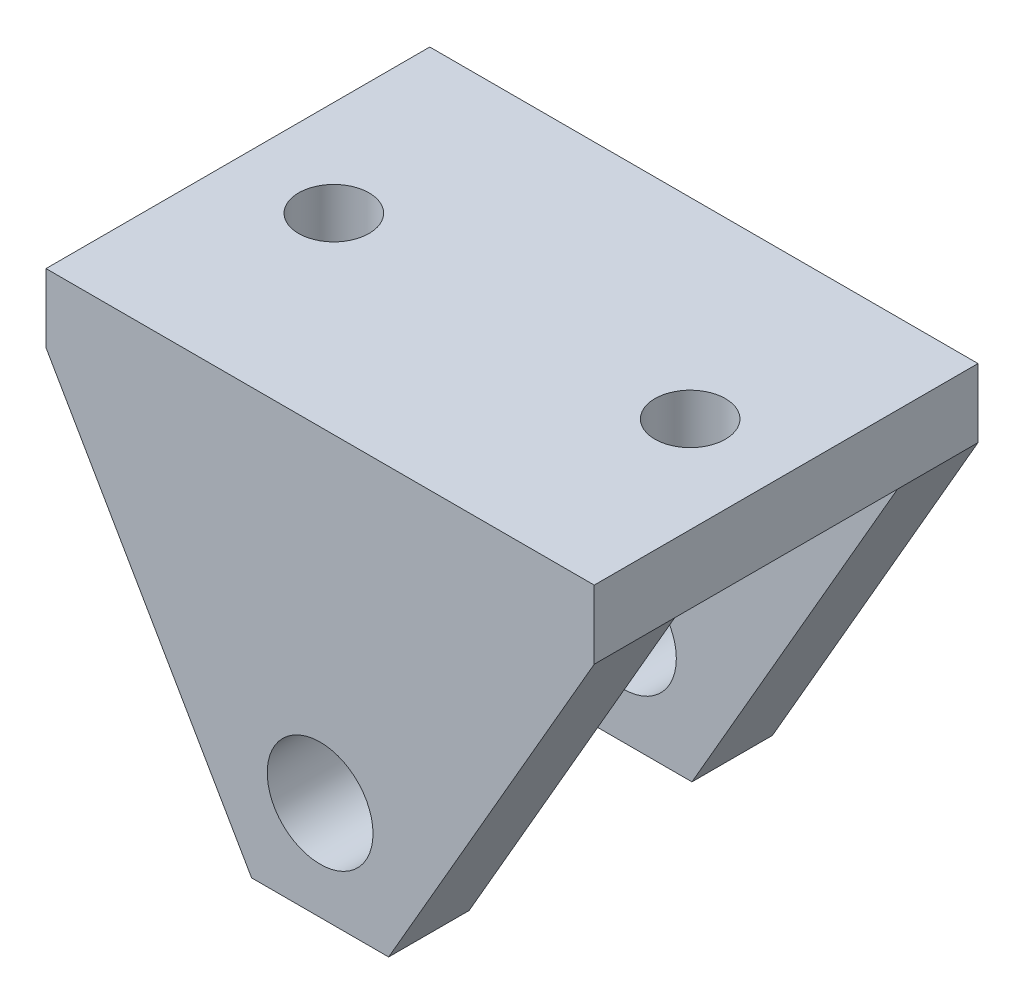
ISO-10303-21;
HEADER;
FILE_DESCRIPTION(('STEP AP214'),'2;1');
FILE_NAME('part.step','',(''),(''),'','','');
FILE_SCHEMA(('AUTOMOTIVE_DESIGN { 1 0 10303 214 1 1 1 1 }'));
ENDSEC;
DATA;
#1=APPLICATION_CONTEXT('core data for automotive mechanical design processes');
#2=APPLICATION_PROTOCOL_DEFINITION('international standard','automotive_design',2000,#1);
#3=PRODUCT_CONTEXT('',#1,'mechanical');
#4=PRODUCT('Part','Part','',(#3));
#5=PRODUCT_RELATED_PRODUCT_CATEGORY('part','',(#4));
#6=PRODUCT_DEFINITION_FORMATION('','',#4);
#7=PRODUCT_DEFINITION_CONTEXT('part definition',#1,'design');
#8=PRODUCT_DEFINITION('design','',#6,#7);
#9=PRODUCT_DEFINITION_SHAPE('','',#8);
#10=(LENGTH_UNIT() NAMED_UNIT(*) SI_UNIT(.MILLI.,.METRE.));
#11=(NAMED_UNIT(*) PLANE_ANGLE_UNIT() SI_UNIT($,.RADIAN.));
#12=(NAMED_UNIT(*) SI_UNIT($,.STERADIAN.) SOLID_ANGLE_UNIT());
#13=UNCERTAINTY_MEASURE_WITH_UNIT(LENGTH_MEASURE(1.E-05),#10,'distance_accuracy_value','');
#14=(GEOMETRIC_REPRESENTATION_CONTEXT(3) GLOBAL_UNCERTAINTY_ASSIGNED_CONTEXT((#13)) GLOBAL_UNIT_ASSIGNED_CONTEXT((#10,
#11,#12)) REPRESENTATION_CONTEXT('',''));
#15=CARTESIAN_POINT('',(0.,0.,0.));
#16=DIRECTION('',(0.,0.,1.));
#17=DIRECTION('',(1.,0.,0.));
#18=AXIS2_PLACEMENT_3D('',#15,#16,#17);
#19=CARTESIAN_POINT('',(0.,-39.37,0.));
#20=DIRECTION('',(0.,1.,0.));
#21=DIRECTION('',(0.,0.,1.));
#22=AXIS2_PLACEMENT_3D('',#19,#20,#21);
#23=PLANE('',#22);
#24=DIRECTION('',(0.,0.,1.));
#25=VECTOR('',#24,1.);
#26=CARTESIAN_POINT('',(-6.35,-39.37,-17.78));
#27=LINE('',#26,#25);
#28=CARTESIAN_POINT('',(-6.35,-39.37,10.3251));
#29=VERTEX_POINT('',#28);
#30=CARTESIAN_POINT('',(-6.35,-39.37,17.78));
#31=VERTEX_POINT('',#30);
#32=EDGE_CURVE('E169',#29,#31,#27,.T.);
#33=ORIENTED_EDGE('',*,*,#32,.F.);
#34=DIRECTION('',(-1.,0.,0.));
#35=VECTOR('',#34,1.);
#36=CARTESIAN_POINT('',(-25.4,-39.37,10.3251));
#37=LINE('',#36,#35);
#38=CARTESIAN_POINT('',(6.35,-39.37,10.3251));
#39=VERTEX_POINT('',#38);
#40=EDGE_CURVE('E145',#39,#29,#37,.T.);
#41=ORIENTED_EDGE('',*,*,#40,.F.);
#42=DIRECTION('',(0.,0.,1.));
#43=VECTOR('',#42,1.);
#44=CARTESIAN_POINT('',(6.35,-39.37,-17.78));
#45=LINE('',#44,#43);
#46=CARTESIAN_POINT('',(6.35,-39.37,17.78));
#47=VERTEX_POINT('',#46);
#48=EDGE_CURVE('E74',#39,#47,#45,.T.);
#49=ORIENTED_EDGE('',*,*,#48,.T.);
#50=DIRECTION('',(1.,0.,0.));
#51=VECTOR('',#50,1.);
#52=CARTESIAN_POINT('',(-25.4,-39.37,17.78));
#53=LINE('',#52,#51);
#54=EDGE_CURVE('E192',#31,#47,#53,.T.);
#55=ORIENTED_EDGE('',*,*,#54,.F.);
#56=EDGE_LOOP('',(#33,#41,#49,#55));
#57=FACE_BOUND('',#56,.T.);
#58=ADVANCED_FACE('F49',(#57),#23,.F.);
#59=CARTESIAN_POINT('',(-16.51,-39.37,0.));
#60=DIRECTION('',(0.,1.,0.));
#61=DIRECTION('',(0.,0.,1.));
#62=AXIS2_PLACEMENT_3D('',#59,#60,#61);
#63=CYLINDRICAL_SURFACE('',#62,3.2639);
#64=CARTESIAN_POINT('',(-16.51,0.,0.));
#65=DIRECTION('',(0.,1.,0.));
#66=DIRECTION('',(0.,0.,1.));
#67=AXIS2_PLACEMENT_3D('',#64,#65,#66);
#68=CIRCLE('',#67,3.2639);
#69=CARTESIAN_POINT('',(-16.51,0.,3.2639));
#70=VERTEX_POINT('',#69);
#71=EDGE_CURVE('E162',#70,#70,#68,.T.);
#72=ORIENTED_EDGE('',*,*,#71,.T.);
#73=EDGE_LOOP('',(#72));
#74=FACE_BOUND('',#73,.T.);
#75=CARTESIAN_POINT('',(-16.51,-6.35,0.));
#76=DIRECTION('',(0.,-1.,0.));
#77=DIRECTION('',(0.,0.,-1.));
#78=AXIS2_PLACEMENT_3D('',#75,#76,#77);
#79=CIRCLE('',#78,3.2639);
#80=CARTESIAN_POINT('',(-16.51,-6.35,-3.2639));
#81=VERTEX_POINT('',#80);
#82=EDGE_CURVE('E187',#81,#81,#79,.F.);
#83=ORIENTED_EDGE('',*,*,#82,.F.);
#84=EDGE_LOOP('',(#83));
#85=FACE_BOUND('',#84,.T.);
#86=ADVANCED_FACE('F277',(#74,#85),#63,.F.);
#87=CARTESIAN_POINT('',(16.51,-39.37,0.));
#88=DIRECTION('',(0.,1.,0.));
#89=DIRECTION('',(0.,0.,1.));
#90=AXIS2_PLACEMENT_3D('',#87,#88,#89);
#91=CYLINDRICAL_SURFACE('',#90,3.2639);
#92=CARTESIAN_POINT('',(16.51,0.,0.));
#93=DIRECTION('',(0.,1.,0.));
#94=DIRECTION('',(0.,0.,-1.));
#95=AXIS2_PLACEMENT_3D('',#92,#93,#94);
#96=CIRCLE('',#95,3.2639);
#97=CARTESIAN_POINT('',(16.51,0.,-3.2639));
#98=VERTEX_POINT('',#97);
#99=EDGE_CURVE('E158',#98,#98,#96,.T.);
#100=ORIENTED_EDGE('',*,*,#99,.T.);
#101=EDGE_LOOP('',(#100));
#102=FACE_BOUND('',#101,.T.);
#103=CARTESIAN_POINT('',(16.51,-6.35,0.));
#104=DIRECTION('',(0.,-1.,0.));
#105=DIRECTION('',(0.,0.,-1.));
#106=AXIS2_PLACEMENT_3D('',#103,#104,#105);
#107=CIRCLE('',#106,3.2639);
#108=CARTESIAN_POINT('',(16.51,-6.35,-3.2639));
#109=VERTEX_POINT('',#108);
#110=EDGE_CURVE('E229',#109,#109,#107,.F.);
#111=ORIENTED_EDGE('',*,*,#110,.F.);
#112=EDGE_LOOP('',(#111));
#113=FACE_BOUND('',#112,.T.);
#114=ADVANCED_FACE('F282',(#102,#113),#91,.F.);
#115=CARTESIAN_POINT('',(25.4,-6.35,-17.78));
#116=DIRECTION('',(-0.8661855860486,0.499722453489577,0.));
#117=DIRECTION('',(-0.499722453489577,-0.866185586048601,0.));
#118=AXIS2_PLACEMENT_3D('',#115,#116,#117);
#119=PLANE('',#118);
#120=ORIENTED_EDGE('',*,*,#48,.F.);
#121=DIRECTION('',(0.499722453489577,0.866185586048601,0.));
#122=VECTOR('',#121,1.);
#123=CARTESIAN_POINT('',(25.4,-6.35,10.3251));
#124=LINE('',#123,#122);
#125=CARTESIAN_POINT('',(25.4,-6.35,10.3251));
#126=VERTEX_POINT('',#125);
#127=EDGE_CURVE('E226',#39,#126,#124,.T.);
#128=ORIENTED_EDGE('',*,*,#127,.T.);
#129=DIRECTION('',(0.,0.,1.));
#130=VECTOR('',#129,1.);
#131=CARTESIAN_POINT('',(25.4,-6.35,-17.78));
#132=LINE('',#131,#130);
#133=CARTESIAN_POINT('',(25.4,-6.35,17.78));
#134=VERTEX_POINT('',#133);
#135=EDGE_CURVE('E177',#126,#134,#132,.T.);
#136=ORIENTED_EDGE('',*,*,#135,.T.);
#137=DIRECTION('',(-0.499722453489577,-0.866185586048601,0.));
#138=VECTOR('',#137,1.);
#139=CARTESIAN_POINT('',(25.4,-6.35,17.78));
#140=LINE('',#139,#138);
#141=EDGE_CURVE('E178',#134,#47,#140,.T.);
#142=ORIENTED_EDGE('',*,*,#141,.T.);
#143=EDGE_LOOP('',(#120,#128,#136,#142));
#144=FACE_BOUND('',#143,.T.);
#145=ADVANCED_FACE('F286',(#144),#119,.F.);
#146=CARTESIAN_POINT('',(-25.4,-6.35,-17.78));
#147=DIRECTION('',(0.8661855860486,0.499722453489577,0.));
#148=DIRECTION('',(-0.499722453489577,0.866185586048601,0.));
#149=AXIS2_PLACEMENT_3D('',#146,#147,#148);
#150=PLANE('',#149);
#151=DIRECTION('',(0.,0.,1.));
#152=VECTOR('',#151,1.);
#153=CARTESIAN_POINT('',(-25.4,-6.35,-17.78));
#154=LINE('',#153,#152);
#155=CARTESIAN_POINT('',(-25.4,-6.35,10.3251));
#156=VERTEX_POINT('',#155);
#157=CARTESIAN_POINT('',(-25.4,-6.35,17.78));
#158=VERTEX_POINT('',#157);
#159=EDGE_CURVE('E159',#156,#158,#154,.T.);
#160=ORIENTED_EDGE('',*,*,#159,.F.);
#161=DIRECTION('',(0.499722453489577,-0.866185586048601,0.));
#162=VECTOR('',#161,1.);
#163=CARTESIAN_POINT('',(-25.4,-6.35,10.3251));
#164=LINE('',#163,#162);
#165=EDGE_CURVE('E223',#156,#29,#164,.T.);
#166=ORIENTED_EDGE('',*,*,#165,.T.);
#167=ORIENTED_EDGE('',*,*,#32,.T.);
#168=DIRECTION('',(-0.499722453489577,0.866185586048601,0.));
#169=VECTOR('',#168,1.);
#170=CARTESIAN_POINT('',(-25.4,-6.35,17.78));
#171=LINE('',#170,#169);
#172=EDGE_CURVE('E166',#31,#158,#171,.T.);
#173=ORIENTED_EDGE('',*,*,#172,.T.);
#174=EDGE_LOOP('',(#160,#166,#167,#173));
#175=FACE_BOUND('',#174,.T.);
#176=ADVANCED_FACE('F242',(#175),#150,.F.);
#177=CARTESIAN_POINT('',(0.,-30.196811844,-17.78));
#178=DIRECTION('',(0.,0.,1.));
#179=DIRECTION('',(1.,0.,0.));
#180=AXIS2_PLACEMENT_3D('',#177,#178,#179);
#181=CYLINDRICAL_SURFACE('',#180,4.9022);
#182=CARTESIAN_POINT('',(0.,-30.196811844,10.3251));
#183=DIRECTION('',(0.,0.,1.));
#184=DIRECTION('',(1.,0.,0.));
#185=AXIS2_PLACEMENT_3D('',#182,#183,#184);
#186=CIRCLE('',#185,4.9022);
#187=CARTESIAN_POINT('',(4.9022,-30.196811844,10.3251));
#188=VERTEX_POINT('',#187);
#189=EDGE_CURVE('E53',#188,#188,#186,.F.);
#190=ORIENTED_EDGE('',*,*,#189,.T.);
#191=EDGE_LOOP('',(#190));
#192=FACE_BOUND('',#191,.T.);
#193=CARTESIAN_POINT('',(0.,-30.196811844,17.78));
#194=DIRECTION('',(0.,0.,1.));
#195=DIRECTION('',(1.,0.,0.));
#196=AXIS2_PLACEMENT_3D('',#193,#194,#195);
#197=CIRCLE('',#196,4.9022);
#198=CARTESIAN_POINT('',(4.9022,-30.196811844,17.78));
#199=VERTEX_POINT('',#198);
#200=EDGE_CURVE('E182',#199,#199,#197,.T.);
#201=ORIENTED_EDGE('',*,*,#200,.T.);
#202=EDGE_LOOP('',(#201));
#203=FACE_BOUND('',#202,.T.);
#204=ADVANCED_FACE('F306',(#192,#203),#181,.F.);
#205=CARTESIAN_POINT('',(-25.4,-39.37,-17.78));
#206=DIRECTION('',(-1.,0.,0.));
#207=DIRECTION('',(0.,0.,1.));
#208=AXIS2_PLACEMENT_3D('',#205,#206,#207);
#209=PLANE('',#208);
#210=CARTESIAN_POINT('',(-25.4,-6.35,-17.78));
#211=VERTEX_POINT('',#210);
#212=CARTESIAN_POINT('',(-25.4,-6.35,-10.3251));
#213=VERTEX_POINT('',#212);
#214=EDGE_CURVE('E150',#211,#213,#154,.T.);
#215=ORIENTED_EDGE('',*,*,#214,.T.);
#216=DIRECTION('',(0.,0.,-1.));
#217=VECTOR('',#216,1.);
#218=CARTESIAN_POINT('',(-25.4,-6.35,10.3251));
#219=LINE('',#218,#217);
#220=EDGE_CURVE('E138',#156,#213,#219,.T.);
#221=ORIENTED_EDGE('',*,*,#220,.F.);
#222=ORIENTED_EDGE('',*,*,#159,.T.);
#223=DIRECTION('',(0.,1.,0.));
#224=VECTOR('',#223,1.);
#225=CARTESIAN_POINT('',(-25.4,-39.37,17.78));
#226=LINE('',#225,#224);
#227=CARTESIAN_POINT('',(-25.4,0.,17.78));
#228=VERTEX_POINT('',#227);
#229=EDGE_CURVE('E199',#158,#228,#226,.T.);
#230=ORIENTED_EDGE('',*,*,#229,.T.);
#231=DIRECTION('',(0.,0.,1.));
#232=VECTOR('',#231,1.);
#233=CARTESIAN_POINT('',(-25.4,0.,-17.78));
#234=LINE('',#233,#232);
#235=CARTESIAN_POINT('',(-25.4,0.,-17.78));
#236=VERTEX_POINT('',#235);
#237=EDGE_CURVE('E191',#236,#228,#234,.T.);
#238=ORIENTED_EDGE('',*,*,#237,.F.);
#239=DIRECTION('',(0.,1.,0.));
#240=VECTOR('',#239,1.);
#241=CARTESIAN_POINT('',(-25.4,-39.37,-17.78));
#242=LINE('',#241,#240);
#243=EDGE_CURVE('E11',#211,#236,#242,.T.);
#244=ORIENTED_EDGE('',*,*,#243,.F.);
#245=EDGE_LOOP('',(#215,#221,#222,#230,#238,#244));
#246=FACE_BOUND('',#245,.T.);
#247=ADVANCED_FACE('F51',(#246),#209,.T.);
#248=CARTESIAN_POINT('',(-25.4,-39.37,-17.78));
#249=DIRECTION('',(0.,0.,-1.));
#250=DIRECTION('',(-1.,0.,0.));
#251=AXIS2_PLACEMENT_3D('',#248,#249,#250);
#252=PLANE('',#251);
#253=DIRECTION('',(-0.499722453489577,0.866185586048601,0.));
#254=VECTOR('',#253,1.);
#255=CARTESIAN_POINT('',(-25.4,-6.35,-17.78));
#256=LINE('',#255,#254);
#257=CARTESIAN_POINT('',(-6.35,-39.37,-17.78));
#258=VERTEX_POINT('',#257);
#259=EDGE_CURVE('E235',#258,#211,#256,.T.);
#260=ORIENTED_EDGE('',*,*,#259,.T.);
#261=ORIENTED_EDGE('',*,*,#243,.T.);
#262=DIRECTION('',(-1.,0.,0.));
#263=VECTOR('',#262,1.);
#264=CARTESIAN_POINT('',(-25.4,0.,-17.78));
#265=LINE('',#264,#263);
#266=CARTESIAN_POINT('',(25.4,0.,-17.78));
#267=VERTEX_POINT('',#266);
#268=EDGE_CURVE('E196',#267,#236,#265,.T.);
#269=ORIENTED_EDGE('',*,*,#268,.F.);
#270=DIRECTION('',(0.,1.,0.));
#271=VECTOR('',#270,1.);
#272=CARTESIAN_POINT('',(25.4,-39.37,-17.78));
#273=LINE('',#272,#271);
#274=CARTESIAN_POINT('',(25.4,-6.35,-17.78));
#275=VERTEX_POINT('',#274);
#276=EDGE_CURVE('E58',#275,#267,#273,.T.);
#277=ORIENTED_EDGE('',*,*,#276,.F.);
#278=DIRECTION('',(-0.499722453489577,-0.866185586048601,0.));
#279=VECTOR('',#278,1.);
#280=CARTESIAN_POINT('',(25.4,-6.35,-17.78));
#281=LINE('',#280,#279);
#282=CARTESIAN_POINT('',(6.35,-39.37,-17.78));
#283=VERTEX_POINT('',#282);
#284=EDGE_CURVE('E173',#275,#283,#281,.T.);
#285=ORIENTED_EDGE('',*,*,#284,.T.);
#286=DIRECTION('',(-1.,0.,0.));
#287=VECTOR('',#286,1.);
#288=CARTESIAN_POINT('',(-25.4,-39.37,-17.78));
#289=LINE('',#288,#287);
#290=EDGE_CURVE('E195',#283,#258,#289,.T.);
#291=ORIENTED_EDGE('',*,*,#290,.T.);
#292=EDGE_LOOP('',(#260,#261,#269,#277,#285,#291));
#293=FACE_BOUND('',#292,.T.);
#294=CARTESIAN_POINT('',(0.,-30.196811844,-17.78));
#295=DIRECTION('',(0.,0.,1.));
#296=DIRECTION('',(1.,0.,0.));
#297=AXIS2_PLACEMENT_3D('',#294,#295,#296);
#298=CIRCLE('',#297,4.9022);
#299=CARTESIAN_POINT('',(4.9022,-30.196811844,-17.78));
#300=VERTEX_POINT('',#299);
#301=EDGE_CURVE('E185',#300,#300,#298,.T.);
#302=ORIENTED_EDGE('',*,*,#301,.T.);
#303=EDGE_LOOP('',(#302));
#304=FACE_BOUND('',#303,.T.);
#305=ADVANCED_FACE('F253',(#293,#304),#252,.T.);
#306=CARTESIAN_POINT('',(25.4,-39.37,-17.78));
#307=DIRECTION('',(1.,0.,0.));
#308=DIRECTION('',(0.,0.,-1.));
#309=AXIS2_PLACEMENT_3D('',#306,#307,#308);
#310=PLANE('',#309);
#311=CARTESIAN_POINT('',(25.4,-6.35,-10.3251));
#312=VERTEX_POINT('',#311);
#313=EDGE_CURVE('E174',#275,#312,#132,.T.);
#314=ORIENTED_EDGE('',*,*,#313,.F.);
#315=ORIENTED_EDGE('',*,*,#276,.T.);
#316=DIRECTION('',(0.,0.,-1.));
#317=VECTOR('',#316,1.);
#318=CARTESIAN_POINT('',(25.4,0.,-17.78));
#319=LINE('',#318,#317);
#320=CARTESIAN_POINT('',(25.4,0.,17.78));
#321=VERTEX_POINT('',#320);
#322=EDGE_CURVE('E205',#321,#267,#319,.T.);
#323=ORIENTED_EDGE('',*,*,#322,.F.);
#324=DIRECTION('',(0.,1.,0.));
#325=VECTOR('',#324,1.);
#326=CARTESIAN_POINT('',(25.4,-39.37,17.78));
#327=LINE('',#326,#325);
#328=EDGE_CURVE('E211',#134,#321,#327,.T.);
#329=ORIENTED_EDGE('',*,*,#328,.F.);
#330=ORIENTED_EDGE('',*,*,#135,.F.);
#331=DIRECTION('',(0.,0.,1.));
#332=VECTOR('',#331,1.);
#333=CARTESIAN_POINT('',(25.4,-6.35,10.3251));
#334=LINE('',#333,#332);
#335=EDGE_CURVE('E137',#312,#126,#334,.T.);
#336=ORIENTED_EDGE('',*,*,#335,.F.);
#337=EDGE_LOOP('',(#314,#315,#323,#329,#330,#336));
#338=FACE_BOUND('',#337,.T.);
#339=ADVANCED_FACE('F258',(#338),#310,.T.);
#340=CARTESIAN_POINT('',(-25.4,-39.37,17.78));
#341=DIRECTION('',(0.,0.,1.));
#342=DIRECTION('',(1.,0.,0.));
#343=AXIS2_PLACEMENT_3D('',#340,#341,#342);
#344=PLANE('',#343);
#345=ORIENTED_EDGE('',*,*,#172,.F.);
#346=ORIENTED_EDGE('',*,*,#54,.T.);
#347=ORIENTED_EDGE('',*,*,#141,.F.);
#348=ORIENTED_EDGE('',*,*,#328,.T.);
#349=DIRECTION('',(1.,0.,0.));
#350=VECTOR('',#349,1.);
#351=CARTESIAN_POINT('',(-25.4,0.,17.78));
#352=LINE('',#351,#350);
#353=EDGE_CURVE('E202',#228,#321,#352,.T.);
#354=ORIENTED_EDGE('',*,*,#353,.F.);
#355=ORIENTED_EDGE('',*,*,#229,.F.);
#356=EDGE_LOOP('',(#345,#346,#347,#348,#354,#355));
#357=FACE_BOUND('',#356,.T.);
#358=ORIENTED_EDGE('',*,*,#200,.F.);
#359=EDGE_LOOP('',(#358));
#360=FACE_BOUND('',#359,.T.);
#361=ADVANCED_FACE('F246',(#357,#360),#344,.T.);
#362=CARTESIAN_POINT('',(6.34999999999999,-39.37,-10.3251));
#363=VERTEX_POINT('',#362);
#364=EDGE_CURVE('E170',#283,#363,#45,.T.);
#365=ORIENTED_EDGE('',*,*,#364,.T.);
#366=DIRECTION('',(1.,0.,0.));
#367=VECTOR('',#366,1.);
#368=CARTESIAN_POINT('',(-25.4,-39.37,-10.3251));
#369=LINE('',#368,#367);
#370=CARTESIAN_POINT('',(-6.35,-39.37,-10.3251));
#371=VERTEX_POINT('',#370);
#372=EDGE_CURVE('E219',#371,#363,#369,.T.);
#373=ORIENTED_EDGE('',*,*,#372,.F.);
#374=EDGE_CURVE('E153',#258,#371,#27,.T.);
#375=ORIENTED_EDGE('',*,*,#374,.F.);
#376=ORIENTED_EDGE('',*,*,#290,.F.);
#377=EDGE_LOOP('',(#365,#373,#375,#376));
#378=FACE_BOUND('',#377,.T.);
#379=ADVANCED_FACE('F264',(#378),#23,.F.);
#380=CARTESIAN_POINT('',(0.,0.,0.));
#381=DIRECTION('',(0.,1.,0.));
#382=DIRECTION('',(0.,0.,1.));
#383=AXIS2_PLACEMENT_3D('',#380,#381,#382);
#384=PLANE('',#383);
#385=ORIENTED_EDGE('',*,*,#99,.F.);
#386=EDGE_LOOP('',(#385));
#387=FACE_BOUND('',#386,.T.);
#388=ORIENTED_EDGE('',*,*,#71,.F.);
#389=EDGE_LOOP('',(#388));
#390=FACE_BOUND('',#389,.T.);
#391=ORIENTED_EDGE('',*,*,#237,.T.);
#392=ORIENTED_EDGE('',*,*,#353,.T.);
#393=ORIENTED_EDGE('',*,*,#322,.T.);
#394=ORIENTED_EDGE('',*,*,#268,.T.);
#395=EDGE_LOOP('',(#391,#392,#393,#394));
#396=FACE_BOUND('',#395,.T.);
#397=ADVANCED_FACE('F250',(#387,#390,#396),#384,.T.);
#398=ORIENTED_EDGE('',*,*,#313,.T.);
#399=DIRECTION('',(-0.499722453489577,-0.866185586048601,0.));
#400=VECTOR('',#399,1.);
#401=CARTESIAN_POINT('',(25.4,-6.35,-10.3251));
#402=LINE('',#401,#400);
#403=EDGE_CURVE('E135',#312,#363,#402,.T.);
#404=ORIENTED_EDGE('',*,*,#403,.T.);
#405=ORIENTED_EDGE('',*,*,#364,.F.);
#406=ORIENTED_EDGE('',*,*,#284,.F.);
#407=EDGE_LOOP('',(#398,#404,#405,#406));
#408=FACE_BOUND('',#407,.T.);
#409=ADVANCED_FACE('F262',(#408),#119,.F.);
#410=ORIENTED_EDGE('',*,*,#374,.T.);
#411=DIRECTION('',(-0.499722453489577,0.866185586048601,0.));
#412=VECTOR('',#411,1.);
#413=CARTESIAN_POINT('',(-25.4,-6.35,-10.3251));
#414=LINE('',#413,#412);
#415=EDGE_CURVE('E132',#371,#213,#414,.T.);
#416=ORIENTED_EDGE('',*,*,#415,.T.);
#417=ORIENTED_EDGE('',*,*,#214,.F.);
#418=ORIENTED_EDGE('',*,*,#259,.F.);
#419=EDGE_LOOP('',(#410,#416,#417,#418));
#420=FACE_BOUND('',#419,.T.);
#421=ADVANCED_FACE('F149',(#420),#150,.F.);
#422=CARTESIAN_POINT('',(0.,-30.196811844,-10.3251));
#423=DIRECTION('',(0.,0.,-1.));
#424=DIRECTION('',(-1.,0.,0.));
#425=AXIS2_PLACEMENT_3D('',#422,#423,#424);
#426=CIRCLE('',#425,4.9022);
#427=CARTESIAN_POINT('',(-4.9022,-30.196811844,-10.3251));
#428=VERTEX_POINT('',#427);
#429=EDGE_CURVE('E154',#428,#428,#426,.F.);
#430=ORIENTED_EDGE('',*,*,#429,.T.);
#431=EDGE_LOOP('',(#430));
#432=FACE_BOUND('',#431,.T.);
#433=ORIENTED_EDGE('',*,*,#301,.F.);
#434=EDGE_LOOP('',(#433));
#435=FACE_BOUND('',#434,.T.);
#436=ADVANCED_FACE('F297',(#432,#435),#181,.F.);
#437=CARTESIAN_POINT('',(0.,-6.35,0.));
#438=DIRECTION('',(0.,-1.,0.));
#439=DIRECTION('',(0.,0.,-1.));
#440=AXIS2_PLACEMENT_3D('',#437,#438,#439);
#441=PLANE('',#440);
#442=ORIENTED_EDGE('',*,*,#220,.T.);
#443=DIRECTION('',(1.,0.,0.));
#444=VECTOR('',#443,1.);
#445=CARTESIAN_POINT('',(-25.4,-6.35,-10.3251));
#446=LINE('',#445,#444);
#447=EDGE_CURVE('E129',#213,#312,#446,.T.);
#448=ORIENTED_EDGE('',*,*,#447,.T.);
#449=ORIENTED_EDGE('',*,*,#335,.T.);
#450=DIRECTION('',(-1.,0.,0.));
#451=VECTOR('',#450,1.);
#452=CARTESIAN_POINT('',(-25.4,-6.35,10.3251));
#453=LINE('',#452,#451);
#454=EDGE_CURVE('E66',#126,#156,#453,.T.);
#455=ORIENTED_EDGE('',*,*,#454,.T.);
#456=EDGE_LOOP('',(#442,#448,#449,#455));
#457=FACE_BOUND('',#456,.T.);
#458=ORIENTED_EDGE('',*,*,#110,.T.);
#459=EDGE_LOOP('',(#458));
#460=FACE_BOUND('',#459,.T.);
#461=ORIENTED_EDGE('',*,*,#82,.T.);
#462=EDGE_LOOP('',(#461));
#463=FACE_BOUND('',#462,.T.);
#464=ADVANCED_FACE('F141',(#457,#460,#463),#441,.T.);
#465=CARTESIAN_POINT('',(-25.4,-6.35,10.3251));
#466=DIRECTION('',(0.,0.,1.));
#467=DIRECTION('',(1.,0.,0.));
#468=AXIS2_PLACEMENT_3D('',#465,#466,#467);
#469=PLANE('',#468);
#470=ORIENTED_EDGE('',*,*,#189,.F.);
#471=EDGE_LOOP('',(#470));
#472=FACE_BOUND('',#471,.T.);
#473=ORIENTED_EDGE('',*,*,#40,.T.);
#474=ORIENTED_EDGE('',*,*,#165,.F.);
#475=ORIENTED_EDGE('',*,*,#454,.F.);
#476=ORIENTED_EDGE('',*,*,#127,.F.);
#477=EDGE_LOOP('',(#473,#474,#475,#476));
#478=FACE_BOUND('',#477,.T.);
#479=ADVANCED_FACE('F288',(#472,#478),#469,.F.);
#480=CARTESIAN_POINT('',(-25.4,-6.35,-10.3251));
#481=DIRECTION('',(0.,0.,-1.));
#482=DIRECTION('',(-1.,0.,0.));
#483=AXIS2_PLACEMENT_3D('',#480,#481,#482);
#484=PLANE('',#483);
#485=ORIENTED_EDGE('',*,*,#429,.F.);
#486=EDGE_LOOP('',(#485));
#487=FACE_BOUND('',#486,.T.);
#488=ORIENTED_EDGE('',*,*,#447,.F.);
#489=ORIENTED_EDGE('',*,*,#415,.F.);
#490=ORIENTED_EDGE('',*,*,#372,.T.);
#491=ORIENTED_EDGE('',*,*,#403,.F.);
#492=EDGE_LOOP('',(#488,#489,#490,#491));
#493=FACE_BOUND('',#492,.T.);
#494=ADVANCED_FACE('F130',(#487,#493),#484,.F.);
#495=CLOSED_SHELL('',(#58,#86,#114,#145,#176,#204,#247,#305,#339,#361,#379,#397,#409,#421,#436,
#464,#479,#494));
#496=MANIFOLD_SOLID_BREP('B2',#495);
#497=ADVANCED_BREP_SHAPE_REPRESENTATION('',(#18,#496),#14);
#498=SHAPE_DEFINITION_REPRESENTATION(#9,#497);
ENDSEC;
END-ISO-10303-21;
